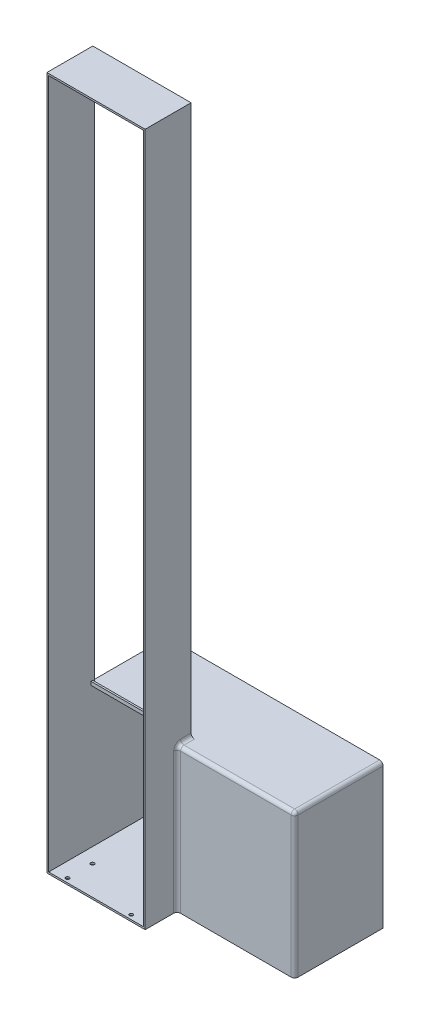
ISO-10303-21;
HEADER;
FILE_DESCRIPTION(('STEP AP214'),'2;1');
FILE_NAME('part.step','',(''),(''),'','','');
FILE_SCHEMA(('AUTOMOTIVE_DESIGN { 1 0 10303 214 1 1 1 1 }'));
ENDSEC;
DATA;
#1=APPLICATION_CONTEXT('core data for automotive mechanical design processes');
#2=APPLICATION_PROTOCOL_DEFINITION('international standard','automotive_design',2000,#1);
#3=PRODUCT_CONTEXT('',#1,'mechanical');
#4=PRODUCT('Part','Part','',(#3));
#5=PRODUCT_RELATED_PRODUCT_CATEGORY('part','',(#4));
#6=PRODUCT_DEFINITION_FORMATION('','',#4);
#7=PRODUCT_DEFINITION_CONTEXT('part definition',#1,'design');
#8=PRODUCT_DEFINITION('design','',#6,#7);
#9=PRODUCT_DEFINITION_SHAPE('','',#8);
#10=(LENGTH_UNIT() NAMED_UNIT(*) SI_UNIT(.MILLI.,.METRE.));
#11=(NAMED_UNIT(*) PLANE_ANGLE_UNIT() SI_UNIT($,.RADIAN.));
#12=(NAMED_UNIT(*) SI_UNIT($,.STERADIAN.) SOLID_ANGLE_UNIT());
#13=UNCERTAINTY_MEASURE_WITH_UNIT(LENGTH_MEASURE(1.E-05),#10,'distance_accuracy_value','');
#14=(GEOMETRIC_REPRESENTATION_CONTEXT(3) GLOBAL_UNCERTAINTY_ASSIGNED_CONTEXT((#13)) GLOBAL_UNIT_ASSIGNED_CONTEXT((#10,
#11,#12)) REPRESENTATION_CONTEXT('',''));
#15=CARTESIAN_POINT('',(0.,0.,0.));
#16=DIRECTION('',(0.,0.,1.));
#17=DIRECTION('',(1.,0.,0.));
#18=AXIS2_PLACEMENT_3D('',#15,#16,#17);
#19=CARTESIAN_POINT('',(-135.,-585.61875,-252.6145));
#20=DIRECTION('',(-1.,0.,0.));
#21=DIRECTION('',(0.,0.,1.));
#22=AXIS2_PLACEMENT_3D('',#19,#20,#21);
#23=PLANE('',#22);
#24=DIRECTION('',(0.,-1.,0.));
#25=VECTOR('',#24,1.);
#26=CARTESIAN_POINT('',(-135.,-585.61875,-35.3945000000002));
#27=LINE('',#26,#25);
#28=CARTESIAN_POINT('',(-135.,-575.61875,-35.3945000000002));
#29=VERTEX_POINT('',#28);
#30=CARTESIAN_POINT('',(-135.,-580.61875,-35.3945000000002));
#31=VERTEX_POINT('',#30);
#32=EDGE_CURVE('E469',#29,#31,#27,.T.);
#33=ORIENTED_EDGE('',*,*,#32,.T.);
#34=DIRECTION('',(0.,0.,1.));
#35=VECTOR('',#34,1.);
#36=CARTESIAN_POINT('',(-135.,-580.61875,0.));
#37=LINE('',#36,#35);
#38=CARTESIAN_POINT('',(-135.,-580.61875,-40.3945000000002));
#39=VERTEX_POINT('',#38);
#40=EDGE_CURVE('E366',#39,#31,#37,.T.);
#41=ORIENTED_EDGE('',*,*,#40,.F.);
#42=DIRECTION('',(0.,-1.,0.));
#43=VECTOR('',#42,1.);
#44=CARTESIAN_POINT('',(-135.,979.38125,-40.3945000000002));
#45=LINE('',#44,#43);
#46=CARTESIAN_POINT('',(-135.,979.38125,-40.3945000000002));
#47=VERTEX_POINT('',#46);
#48=EDGE_CURVE('E244',#47,#39,#45,.T.);
#49=ORIENTED_EDGE('',*,*,#48,.F.);
#50=DIRECTION('',(0.,0.,-1.));
#51=VECTOR('',#50,1.);
#52=CARTESIAN_POINT('',(-135.,979.38125,90.3874999999998));
#53=LINE('',#52,#51);
#54=CARTESIAN_POINT('',(-135.,979.38125,90.3874999999998));
#55=VERTEX_POINT('',#54);
#56=EDGE_CURVE('E238',#55,#47,#53,.T.);
#57=ORIENTED_EDGE('',*,*,#56,.F.);
#58=DIRECTION('',(0.,-1.,0.));
#59=VECTOR('',#58,1.);
#60=CARTESIAN_POINT('',(-135.,-585.61875,90.3874999999998));
#61=LINE('',#60,#59);
#62=CARTESIAN_POINT('',(-135.,-985.61875,90.3874999999998));
#63=VERTEX_POINT('',#62);
#64=EDGE_CURVE('E303',#55,#63,#61,.T.);
#65=ORIENTED_EDGE('',*,*,#64,.T.);
#66=DIRECTION('',(0.,0.,-1.));
#67=VECTOR('',#66,1.);
#68=CARTESIAN_POINT('',(-135.,-985.61875,-252.6145));
#69=LINE('',#68,#67);
#70=CARTESIAN_POINT('',(-135.,-985.61875,-252.6145));
#71=VERTEX_POINT('',#70);
#72=EDGE_CURVE('E297',#63,#71,#69,.T.);
#73=ORIENTED_EDGE('',*,*,#72,.T.);
#74=DIRECTION('',(0.,-1.,0.));
#75=VECTOR('',#74,1.);
#76=CARTESIAN_POINT('',(-135.,-585.61875,-252.6145));
#77=LINE('',#76,#75);
#78=CARTESIAN_POINT('',(-135.,-585.61875,-252.6145));
#79=VERTEX_POINT('',#78);
#80=EDGE_CURVE('E300',#79,#71,#77,.T.);
#81=ORIENTED_EDGE('',*,*,#80,.F.);
#82=DIRECTION('',(0.,0.,-1.));
#83=VECTOR('',#82,1.);
#84=CARTESIAN_POINT('',(-135.,-585.61875,-252.6145));
#85=LINE('',#84,#83);
#86=CARTESIAN_POINT('',(-135.,-585.61875,-30.3945000000002));
#87=VERTEX_POINT('',#86);
#88=EDGE_CURVE('E49',#87,#79,#85,.T.);
#89=ORIENTED_EDGE('',*,*,#88,.F.);
#90=DIRECTION('',(0.,1.,0.));
#91=VECTOR('',#90,1.);
#92=CARTESIAN_POINT('',(-135.,-585.61875,-30.3945000000002));
#93=LINE('',#92,#91);
#94=CARTESIAN_POINT('',(-135.,-575.61875,-30.3945000000002));
#95=VERTEX_POINT('',#94);
#96=EDGE_CURVE('E53',#87,#95,#93,.T.);
#97=ORIENTED_EDGE('',*,*,#96,.T.);
#98=DIRECTION('',(0.,0.,-1.));
#99=VECTOR('',#98,1.);
#100=CARTESIAN_POINT('',(-135.,-575.61875,-35.3945000000002));
#101=LINE('',#100,#99);
#102=EDGE_CURVE('E471',#95,#29,#101,.T.);
#103=ORIENTED_EDGE('',*,*,#102,.T.);
#104=EDGE_LOOP('',(#33,#41,#49,#57,#65,#73,#81,#89,#97,#103));
#105=FACE_BOUND('',#104,.T.);
#106=ADVANCED_FACE('F32',(#105),#23,.F.);
#107=CARTESIAN_POINT('',(135.,-585.61875,90.3874999999998));
#108=DIRECTION('',(1.,0.,0.));
#109=DIRECTION('',(0.,0.,-1.));
#110=AXIS2_PLACEMENT_3D('',#107,#108,#109);
#111=PLANE('',#110);
#112=DIRECTION('',(0.,-1.,0.));
#113=VECTOR('',#112,1.);
#114=CARTESIAN_POINT('',(135.,-585.61875,-35.3945000000002));
#115=LINE('',#114,#113);
#116=CARTESIAN_POINT('',(135.,-575.61875,-35.3945000000003));
#117=VERTEX_POINT('',#116);
#118=CARTESIAN_POINT('',(135.,-580.61875,-35.3945000000002));
#119=VERTEX_POINT('',#118);
#120=EDGE_CURVE('E484',#117,#119,#115,.T.);
#121=ORIENTED_EDGE('',*,*,#120,.F.);
#122=DIRECTION('',(0.,0.,-1.));
#123=VECTOR('',#122,1.);
#124=CARTESIAN_POINT('',(135.,-575.61875,-35.3945000000002));
#125=LINE('',#124,#123);
#126=CARTESIAN_POINT('',(135.,-575.61875,-30.3945000000002));
#127=VERTEX_POINT('',#126);
#128=EDGE_CURVE('E477',#127,#117,#125,.T.);
#129=ORIENTED_EDGE('',*,*,#128,.F.);
#130=DIRECTION('',(0.,1.,0.));
#131=VECTOR('',#130,1.);
#132=CARTESIAN_POINT('',(135.,-585.61875,-30.3945000000002));
#133=LINE('',#132,#131);
#134=CARTESIAN_POINT('',(135.,-585.61875,-30.3945000000002));
#135=VERTEX_POINT('',#134);
#136=EDGE_CURVE('E483',#135,#127,#133,.T.);
#137=ORIENTED_EDGE('',*,*,#136,.F.);
#138=DIRECTION('',(0.,0.,1.));
#139=VECTOR('',#138,1.);
#140=CARTESIAN_POINT('',(135.,-585.61875,90.3874999999998));
#141=LINE('',#140,#139);
#142=CARTESIAN_POINT('',(135.,-585.61875,-5.53750000000025));
#143=VERTEX_POINT('',#142);
#144=EDGE_CURVE('E261',#135,#143,#141,.T.);
#145=ORIENTED_EDGE('',*,*,#144,.T.);
#146=DIRECTION('',(0.,-1.,0.));
#147=VECTOR('',#146,1.);
#148=CARTESIAN_POINT('',(135.,-585.61875,-5.53750000000025));
#149=LINE('',#148,#147);
#150=CARTESIAN_POINT('',(135.,-985.61875,-5.53750000000025));
#151=VERTEX_POINT('',#150);
#152=EDGE_CURVE('E289',#143,#151,#149,.T.);
#153=ORIENTED_EDGE('',*,*,#152,.T.);
#154=DIRECTION('',(0.,0.,1.));
#155=VECTOR('',#154,1.);
#156=CARTESIAN_POINT('',(135.,-985.61875,90.3874999999998));
#157=LINE('',#156,#155);
#158=CARTESIAN_POINT('',(135.,-985.61875,90.3874999999998));
#159=VERTEX_POINT('',#158);
#160=EDGE_CURVE('E279',#151,#159,#157,.T.);
#161=ORIENTED_EDGE('',*,*,#160,.T.);
#162=DIRECTION('',(0.,-1.,0.));
#163=VECTOR('',#162,1.);
#164=CARTESIAN_POINT('',(135.,-585.61875,90.3874999999998));
#165=LINE('',#164,#163);
#166=CARTESIAN_POINT('',(135.,979.38125,90.3874999999998));
#167=VERTEX_POINT('',#166);
#168=EDGE_CURVE('E282',#167,#159,#165,.T.);
#169=ORIENTED_EDGE('',*,*,#168,.F.);
#170=DIRECTION('',(0.,0.,1.));
#171=VECTOR('',#170,1.);
#172=CARTESIAN_POINT('',(135.,979.38125,90.3874999999998));
#173=LINE('',#172,#171);
#174=CARTESIAN_POINT('',(135.,979.38125,-40.3945000000002));
#175=VERTEX_POINT('',#174);
#176=EDGE_CURVE('E247',#175,#167,#173,.T.);
#177=ORIENTED_EDGE('',*,*,#176,.F.);
#178=DIRECTION('',(0.,-1.,0.));
#179=VECTOR('',#178,1.);
#180=CARTESIAN_POINT('',(135.,979.38125,-40.3945000000002));
#181=LINE('',#180,#179);
#182=CARTESIAN_POINT('',(135.,-580.61875,-40.3945000000002));
#183=VERTEX_POINT('',#182);
#184=EDGE_CURVE('E250',#175,#183,#181,.T.);
#185=ORIENTED_EDGE('',*,*,#184,.T.);
#186=DIRECTION('',(0.,0.,1.));
#187=VECTOR('',#186,1.);
#188=CARTESIAN_POINT('',(135.,-580.61875,90.3874999999998));
#189=LINE('',#188,#187);
#190=EDGE_CURVE('E251',#183,#119,#189,.T.);
#191=ORIENTED_EDGE('',*,*,#190,.T.);
#192=EDGE_LOOP('',(#121,#129,#137,#145,#153,#161,#169,#177,#185,#191));
#193=FACE_BOUND('',#192,.T.);
#194=ADVANCED_FACE('F497',(#193),#111,.F.);
#195=CARTESIAN_POINT('',(0.,-580.61875,0.));
#196=DIRECTION('',(0.,1.,0.));
#197=DIRECTION('',(0.,0.,1.));
#198=AXIS2_PLACEMENT_3D('',#195,#196,#197);
#199=PLANE('',#198);
#200=DIRECTION('',(1.,0.,0.));
#201=VECTOR('',#200,1.);
#202=CARTESIAN_POINT('',(474.951,-580.61875,-10.5375000000003));
#203=LINE('',#202,#201);
#204=CARTESIAN_POINT('',(150.,-580.61875,-10.5375000000003));
#205=VERTEX_POINT('',#204);
#206=CARTESIAN_POINT('',(464.951,-580.61875,-10.5375000000003));
#207=VERTEX_POINT('',#206);
#208=EDGE_CURVE('E384',#205,#207,#203,.T.);
#209=ORIENTED_EDGE('',*,*,#208,.T.);
#210=DIRECTION('',(0.,0.,-1.));
#211=VECTOR('',#210,1.);
#212=CARTESIAN_POINT('',(464.951,-580.61875,-252.6145));
#213=LINE('',#212,#211);
#214=CARTESIAN_POINT('',(464.951,-580.61875,-252.6145));
#215=VERTEX_POINT('',#214);
#216=EDGE_CURVE('E386',#207,#215,#213,.T.);
#217=ORIENTED_EDGE('',*,*,#216,.T.);
#218=DIRECTION('',(-1.,0.,0.));
#219=VECTOR('',#218,1.);
#220=CARTESIAN_POINT('',(-135.,-580.61875,-252.6145));
#221=LINE('',#220,#219);
#222=CARTESIAN_POINT('',(-140.,-580.61875,-252.6145));
#223=VERTEX_POINT('',#222);
#224=EDGE_CURVE('E262',#215,#223,#221,.T.);
#225=ORIENTED_EDGE('',*,*,#224,.T.);
#226=DIRECTION('',(0.,0.,1.));
#227=VECTOR('',#226,1.);
#228=CARTESIAN_POINT('',(-140.,-580.61875,-252.6145));
#229=LINE('',#228,#227);
#230=CARTESIAN_POINT('',(-140.,-580.61875,-40.3945000000002));
#231=VERTEX_POINT('',#230);
#232=EDGE_CURVE('E264',#223,#231,#229,.T.);
#233=ORIENTED_EDGE('',*,*,#232,.T.);
#234=DIRECTION('',(-1.,0.,0.));
#235=VECTOR('',#234,1.);
#236=CARTESIAN_POINT('',(-135.,-580.61875,-40.3945000000002));
#237=LINE('',#236,#235);
#238=EDGE_CURVE('E235',#39,#231,#237,.T.);
#239=ORIENTED_EDGE('',*,*,#238,.F.);
#240=ORIENTED_EDGE('',*,*,#40,.T.);
#241=DIRECTION('',(1.,0.,0.));
#242=VECTOR('',#241,1.);
#243=CARTESIAN_POINT('',(135.,-580.61875,-35.3945000000002));
#244=LINE('',#243,#242);
#245=EDGE_CURVE('E268',#31,#119,#244,.T.);
#246=ORIENTED_EDGE('',*,*,#245,.T.);
#247=ORIENTED_EDGE('',*,*,#190,.F.);
#248=DIRECTION('',(-1.,0.,0.));
#249=VECTOR('',#248,1.);
#250=CARTESIAN_POINT('',(135.,-580.61875,-40.3945000000002));
#251=LINE('',#250,#249);
#252=CARTESIAN_POINT('',(150.,-580.61875,-40.3945000000002));
#253=VERTEX_POINT('',#252);
#254=EDGE_CURVE('E246',#253,#183,#251,.T.);
#255=ORIENTED_EDGE('',*,*,#254,.F.);
#256=DIRECTION('',(0.,0.,-1.));
#257=VECTOR('',#256,1.);
#258=CARTESIAN_POINT('',(150.,-580.61875,0.));
#259=LINE('',#258,#257);
#260=EDGE_CURVE('E382',#253,#205,#259,.F.);
#261=ORIENTED_EDGE('',*,*,#260,.T.);
#262=EDGE_LOOP('',(#209,#217,#225,#233,#239,#240,#246,#247,#255,#261));
#263=FACE_BOUND('',#262,.T.);
#264=ADVANCED_FACE('F427',(#263),#199,.T.);
#265=CARTESIAN_POINT('',(0.,-985.61875,0.));
#266=DIRECTION('',(0.,1.,0.));
#267=DIRECTION('',(0.,0.,1.));
#268=AXIS2_PLACEMENT_3D('',#265,#266,#267);
#269=PLANE('',#268);
#270=CARTESIAN_POINT('',(-92.9999999999998,-985.61875,78.3874999999998));
#271=DIRECTION('',(0.,-1.,0.));
#272=DIRECTION('',(0.,0.,-1.));
#273=AXIS2_PLACEMENT_3D('',#270,#271,#272);
#274=CIRCLE('',#273,5.00000000000001);
#275=CARTESIAN_POINT('',(-92.9999999999998,-985.61875,73.3874999999998));
#276=VERTEX_POINT('',#275);
#277=EDGE_CURVE('E310',#276,#276,#274,.T.);
#278=ORIENTED_EDGE('',*,*,#277,.T.);
#279=EDGE_LOOP('',(#278));
#280=FACE_BOUND('',#279,.T.);
#281=CARTESIAN_POINT('',(88.0000000000002,-985.61875,7.38749999999978));
#282=DIRECTION('',(0.,-1.,0.));
#283=DIRECTION('',(0.,0.,-1.));
#284=AXIS2_PLACEMENT_3D('',#281,#282,#283);
#285=CIRCLE('',#284,5.);
#286=CARTESIAN_POINT('',(88.0000000000002,-985.61875,2.38749999999978));
#287=VERTEX_POINT('',#286);
#288=EDGE_CURVE('E322',#287,#287,#285,.T.);
#289=ORIENTED_EDGE('',*,*,#288,.T.);
#290=EDGE_LOOP('',(#289));
#291=FACE_BOUND('',#290,.T.);
#292=CARTESIAN_POINT('',(88.0000000000002,-985.61875,-194.6125));
#293=DIRECTION('',(0.,-1.,0.));
#294=DIRECTION('',(0.,0.,-1.));
#295=AXIS2_PLACEMENT_3D('',#292,#293,#294);
#296=CIRCLE('',#295,5.00000000000001);
#297=CARTESIAN_POINT('',(88.0000000000002,-985.61875,-199.6125));
#298=VERTEX_POINT('',#297);
#299=EDGE_CURVE('E334',#298,#298,#296,.T.);
#300=ORIENTED_EDGE('',*,*,#299,.T.);
#301=EDGE_LOOP('',(#300));
#302=FACE_BOUND('',#301,.T.);
#303=CARTESIAN_POINT('',(-92.9999999999998,-985.61875,-194.6125));
#304=DIRECTION('',(0.,-1.,0.));
#305=DIRECTION('',(0.,0.,-1.));
#306=AXIS2_PLACEMENT_3D('',#303,#304,#305);
#307=CIRCLE('',#306,5.00000000000001);
#308=CARTESIAN_POINT('',(-92.9999999999998,-985.61875,-199.6125));
#309=VERTEX_POINT('',#308);
#310=EDGE_CURVE('E328',#309,#309,#307,.T.);
#311=ORIENTED_EDGE('',*,*,#310,.T.);
#312=EDGE_LOOP('',(#311));
#313=FACE_BOUND('',#312,.T.);
#314=CARTESIAN_POINT('',(-92.9999999999998,-985.61875,7.38749999999978));
#315=DIRECTION('',(0.,-1.,0.));
#316=DIRECTION('',(0.,0.,-1.));
#317=AXIS2_PLACEMENT_3D('',#314,#315,#316);
#318=CIRCLE('',#317,5.);
#319=CARTESIAN_POINT('',(-92.9999999999998,-985.61875,2.38749999999978));
#320=VERTEX_POINT('',#319);
#321=EDGE_CURVE('E316',#320,#320,#318,.T.);
#322=ORIENTED_EDGE('',*,*,#321,.T.);
#323=EDGE_LOOP('',(#322));
#324=FACE_BOUND('',#323,.T.);
#325=CARTESIAN_POINT('',(88.0000000000002,-985.61875,78.3874999999998));
#326=DIRECTION('',(0.,-1.,0.));
#327=DIRECTION('',(0.,0.,-1.));
#328=AXIS2_PLACEMENT_3D('',#325,#326,#327);
#329=CIRCLE('',#328,5.00000000000001);
#330=CARTESIAN_POINT('',(88.0000000000002,-985.61875,73.3874999999998));
#331=VERTEX_POINT('',#330);
#332=EDGE_CURVE('E306',#331,#331,#329,.T.);
#333=ORIENTED_EDGE('',*,*,#332,.T.);
#334=EDGE_LOOP('',(#333));
#335=FACE_BOUND('',#334,.T.);
#336=DIRECTION('',(-1.,0.,0.));
#337=VECTOR('',#336,1.);
#338=CARTESIAN_POINT('',(135.,-985.61875,-5.53750000000025));
#339=LINE('',#338,#337);
#340=CARTESIAN_POINT('',(469.951,-985.61875,-5.53750000000025));
#341=VERTEX_POINT('',#340);
#342=EDGE_CURVE('E284',#341,#151,#339,.T.);
#343=ORIENTED_EDGE('',*,*,#342,.F.);
#344=DIRECTION('',(0.,0.,1.));
#345=VECTOR('',#344,1.);
#346=CARTESIAN_POINT('',(469.951,-985.61875,-5.53750000000025));
#347=LINE('',#346,#345);
#348=CARTESIAN_POINT('',(469.951,-985.61875,-252.6145));
#349=VERTEX_POINT('',#348);
#350=EDGE_CURVE('E274',#349,#341,#347,.T.);
#351=ORIENTED_EDGE('',*,*,#350,.F.);
#352=DIRECTION('',(1.,0.,0.));
#353=VECTOR('',#352,1.);
#354=CARTESIAN_POINT('',(474.951,-985.61875,-252.6145));
#355=LINE('',#354,#353);
#356=EDGE_CURVE('E340',#71,#349,#355,.T.);
#357=ORIENTED_EDGE('',*,*,#356,.F.);
#358=ORIENTED_EDGE('',*,*,#72,.F.);
#359=DIRECTION('',(-1.,0.,0.));
#360=VECTOR('',#359,1.);
#361=CARTESIAN_POINT('',(-140.,-985.61875,90.3874999999998));
#362=LINE('',#361,#360);
#363=EDGE_CURVE('E345',#159,#63,#362,.T.);
#364=ORIENTED_EDGE('',*,*,#363,.F.);
#365=ORIENTED_EDGE('',*,*,#160,.F.);
#366=EDGE_LOOP('',(#343,#351,#357,#358,#364,#365));
#367=FACE_BOUND('',#366,.T.);
#368=ADVANCED_FACE('F544',(#280,#291,#302,#313,#324,#335,#367),#269,.T.);
#369=CARTESIAN_POINT('',(0.,-990.61875,0.));
#370=DIRECTION('',(0.,1.,0.));
#371=DIRECTION('',(0.,0.,1.));
#372=AXIS2_PLACEMENT_3D('',#369,#370,#371);
#373=PLANE('',#372);
#374=DIRECTION('',(0.,0.,1.));
#375=VECTOR('',#374,1.);
#376=CARTESIAN_POINT('',(474.951,-990.61875,-0.537500000000255));
#377=LINE('',#376,#375);
#378=CARTESIAN_POINT('',(474.951,-990.61875,-252.6145));
#379=VERTEX_POINT('',#378);
#380=CARTESIAN_POINT('',(474.951,-990.61875,-10.5375000000003));
#381=VERTEX_POINT('',#380);
#382=EDGE_CURVE('E347',#379,#381,#377,.T.);
#383=ORIENTED_EDGE('',*,*,#382,.T.);
#384=CARTESIAN_POINT('',(464.951,-990.61875,-10.5375000000003));
#385=DIRECTION('',(0.,1.,0.));
#386=DIRECTION('',(0.,0.,1.));
#387=AXIS2_PLACEMENT_3D('',#384,#385,#386);
#388=CIRCLE('',#387,10.);
#389=CARTESIAN_POINT('',(464.951,-990.61875,-0.537500000000255));
#390=VERTEX_POINT('',#389);
#391=EDGE_CURVE('E380',#381,#390,#388,.F.);
#392=ORIENTED_EDGE('',*,*,#391,.T.);
#393=DIRECTION('',(-1.,0.,0.));
#394=VECTOR('',#393,1.);
#395=CARTESIAN_POINT('',(140.,-990.61875,-0.537500000000255));
#396=LINE('',#395,#394);
#397=CARTESIAN_POINT('',(150.,-990.61875,-0.537500000000255));
#398=VERTEX_POINT('',#397);
#399=EDGE_CURVE('E350',#390,#398,#396,.T.);
#400=ORIENTED_EDGE('',*,*,#399,.T.);
#401=CARTESIAN_POINT('',(150.,-990.61875,9.46249999999975));
#402=DIRECTION('',(0.,1.,0.));
#403=DIRECTION('',(0.,0.,1.));
#404=AXIS2_PLACEMENT_3D('',#401,#402,#403);
#405=CIRCLE('',#404,10.);
#406=CARTESIAN_POINT('',(140.,-990.61875,9.46249999999975));
#407=VERTEX_POINT('',#406);
#408=EDGE_CURVE('E11',#398,#407,#405,.T.);
#409=ORIENTED_EDGE('',*,*,#408,.T.);
#410=DIRECTION('',(0.,0.,1.));
#411=VECTOR('',#410,1.);
#412=CARTESIAN_POINT('',(140.,-990.61875,90.3874999999998));
#413=LINE('',#412,#411);
#414=CARTESIAN_POINT('',(140.,-990.61875,90.3874999999998));
#415=VERTEX_POINT('',#414);
#416=EDGE_CURVE('E353',#407,#415,#413,.T.);
#417=ORIENTED_EDGE('',*,*,#416,.T.);
#418=DIRECTION('',(-1.,0.,0.));
#419=VECTOR('',#418,1.);
#420=CARTESIAN_POINT('',(-140.,-990.61875,90.3874999999998));
#421=LINE('',#420,#419);
#422=CARTESIAN_POINT('',(-140.,-990.61875,90.3874999999998));
#423=VERTEX_POINT('',#422);
#424=EDGE_CURVE('E208',#415,#423,#421,.T.);
#425=ORIENTED_EDGE('',*,*,#424,.T.);
#426=DIRECTION('',(0.,0.,-1.));
#427=VECTOR('',#426,1.);
#428=CARTESIAN_POINT('',(-140.,-990.61875,-252.6145));
#429=LINE('',#428,#427);
#430=CARTESIAN_POINT('',(-140.,-990.61875,-252.6145));
#431=VERTEX_POINT('',#430);
#432=EDGE_CURVE('E204',#423,#431,#429,.T.);
#433=ORIENTED_EDGE('',*,*,#432,.T.);
#434=DIRECTION('',(1.,0.,0.));
#435=VECTOR('',#434,1.);
#436=CARTESIAN_POINT('',(474.951,-990.61875,-252.6145));
#437=LINE('',#436,#435);
#438=EDGE_CURVE('E344',#431,#379,#437,.T.);
#439=ORIENTED_EDGE('',*,*,#438,.T.);
#440=EDGE_LOOP('',(#383,#392,#400,#409,#417,#425,#433,#439));
#441=FACE_BOUND('',#440,.T.);
#442=CARTESIAN_POINT('',(88.0000000000002,-990.61875,-194.6125));
#443=DIRECTION('',(0.,-1.,0.));
#444=DIRECTION('',(0.,0.,-1.));
#445=AXIS2_PLACEMENT_3D('',#442,#443,#444);
#446=CIRCLE('',#445,5.00000000000001);
#447=CARTESIAN_POINT('',(88.0000000000002,-990.61875,-199.6125));
#448=VERTEX_POINT('',#447);
#449=EDGE_CURVE('E337',#448,#448,#446,.T.);
#450=ORIENTED_EDGE('',*,*,#449,.F.);
#451=EDGE_LOOP('',(#450));
#452=FACE_BOUND('',#451,.T.);
#453=CARTESIAN_POINT('',(-92.9999999999998,-990.61875,-194.6125));
#454=DIRECTION('',(0.,-1.,0.));
#455=DIRECTION('',(0.,0.,-1.));
#456=AXIS2_PLACEMENT_3D('',#453,#454,#455);
#457=CIRCLE('',#456,5.00000000000001);
#458=CARTESIAN_POINT('',(-92.9999999999998,-990.61875,-199.6125));
#459=VERTEX_POINT('',#458);
#460=EDGE_CURVE('E331',#459,#459,#457,.T.);
#461=ORIENTED_EDGE('',*,*,#460,.F.);
#462=EDGE_LOOP('',(#461));
#463=FACE_BOUND('',#462,.T.);
#464=CARTESIAN_POINT('',(88.0000000000002,-990.61875,7.38749999999978));
#465=DIRECTION('',(0.,-1.,0.));
#466=DIRECTION('',(0.,0.,-1.));
#467=AXIS2_PLACEMENT_3D('',#464,#465,#466);
#468=CIRCLE('',#467,5.);
#469=CARTESIAN_POINT('',(88.0000000000002,-990.61875,2.38749999999978));
#470=VERTEX_POINT('',#469);
#471=EDGE_CURVE('E325',#470,#470,#468,.T.);
#472=ORIENTED_EDGE('',*,*,#471,.F.);
#473=EDGE_LOOP('',(#472));
#474=FACE_BOUND('',#473,.T.);
#475=CARTESIAN_POINT('',(-92.9999999999998,-990.61875,7.38749999999978));
#476=DIRECTION('',(0.,-1.,0.));
#477=DIRECTION('',(0.,0.,-1.));
#478=AXIS2_PLACEMENT_3D('',#475,#476,#477);
#479=CIRCLE('',#478,5.);
#480=CARTESIAN_POINT('',(-92.9999999999998,-990.61875,2.38749999999978));
#481=VERTEX_POINT('',#480);
#482=EDGE_CURVE('E319',#481,#481,#479,.T.);
#483=ORIENTED_EDGE('',*,*,#482,.F.);
#484=EDGE_LOOP('',(#483));
#485=FACE_BOUND('',#484,.T.);
#486=CARTESIAN_POINT('',(-92.9999999999998,-990.61875,78.3874999999998));
#487=DIRECTION('',(0.,-1.,0.));
#488=DIRECTION('',(0.,0.,-1.));
#489=AXIS2_PLACEMENT_3D('',#486,#487,#488);
#490=CIRCLE('',#489,5.00000000000001);
#491=CARTESIAN_POINT('',(-92.9999999999998,-990.61875,73.3874999999998));
#492=VERTEX_POINT('',#491);
#493=EDGE_CURVE('E313',#492,#492,#490,.T.);
#494=ORIENTED_EDGE('',*,*,#493,.F.);
#495=EDGE_LOOP('',(#494));
#496=FACE_BOUND('',#495,.T.);
#497=CARTESIAN_POINT('',(88.0000000000002,-990.61875,78.3874999999998));
#498=DIRECTION('',(0.,-1.,0.));
#499=DIRECTION('',(0.,0.,-1.));
#500=AXIS2_PLACEMENT_3D('',#497,#498,#499);
#501=CIRCLE('',#500,5.00000000000001);
#502=CARTESIAN_POINT('',(88.0000000000002,-990.61875,73.3874999999998));
#503=VERTEX_POINT('',#502);
#504=EDGE_CURVE('E307',#503,#503,#501,.T.);
#505=ORIENTED_EDGE('',*,*,#504,.F.);
#506=EDGE_LOOP('',(#505));
#507=FACE_BOUND('',#506,.T.);
#508=ADVANCED_FACE('F445',(#441,#452,#463,#474,#485,#496,#507),#373,.F.);
#509=CARTESIAN_POINT('',(-140.,-990.61875,-252.6145));
#510=DIRECTION('',(1.,0.,0.));
#511=DIRECTION('',(0.,0.,-1.));
#512=AXIS2_PLACEMENT_3D('',#509,#510,#511);
#513=PLANE('',#512);
#514=DIRECTION('',(0.,1.,0.));
#515=VECTOR('',#514,1.);
#516=CARTESIAN_POINT('',(-140.,-990.61875,90.3874999999998));
#517=LINE('',#516,#515);
#518=CARTESIAN_POINT('',(-140.,984.38125,90.3874999999998));
#519=VERTEX_POINT('',#518);
#520=EDGE_CURVE('E196',#423,#519,#517,.T.);
#521=ORIENTED_EDGE('',*,*,#520,.T.);
#522=DIRECTION('',(0.,0.,1.));
#523=VECTOR('',#522,1.);
#524=CARTESIAN_POINT('',(-140.,984.38125,90.3874999999998));
#525=LINE('',#524,#523);
#526=CARTESIAN_POINT('',(-140.,984.38125,-40.3945000000002));
#527=VERTEX_POINT('',#526);
#528=EDGE_CURVE('E201',#527,#519,#525,.T.);
#529=ORIENTED_EDGE('',*,*,#528,.F.);
#530=DIRECTION('',(0.,-1.,0.));
#531=VECTOR('',#530,1.);
#532=CARTESIAN_POINT('',(-140.,979.38125,-40.3945000000002));
#533=LINE('',#532,#531);
#534=EDGE_CURVE('E241',#527,#231,#533,.T.);
#535=ORIENTED_EDGE('',*,*,#534,.T.);
#536=ORIENTED_EDGE('',*,*,#232,.F.);
#537=DIRECTION('',(0.,1.,0.));
#538=VECTOR('',#537,1.);
#539=CARTESIAN_POINT('',(-140.,-990.61875,-252.6145));
#540=LINE('',#539,#538);
#541=EDGE_CURVE('E363',#431,#223,#540,.T.);
#542=ORIENTED_EDGE('',*,*,#541,.F.);
#543=ORIENTED_EDGE('',*,*,#432,.F.);
#544=EDGE_LOOP('',(#521,#529,#535,#536,#542,#543));
#545=FACE_BOUND('',#544,.T.);
#546=ADVANCED_FACE('F198',(#545),#513,.F.);
#547=CARTESIAN_POINT('',(474.951,-990.61875,-252.6145));
#548=DIRECTION('',(0.,0.,1.));
#549=DIRECTION('',(1.,0.,0.));
#550=AXIS2_PLACEMENT_3D('',#547,#548,#549);
#551=PLANE('',#550);
#552=ORIENTED_EDGE('',*,*,#224,.F.);
#553=CARTESIAN_POINT('',(464.951,-590.61875,-252.6145));
#554=DIRECTION('',(0.,0.,1.));
#555=DIRECTION('',(1.,0.,0.));
#556=AXIS2_PLACEMENT_3D('',#553,#554,#555);
#557=CIRCLE('',#556,10.);
#558=CARTESIAN_POINT('',(474.951,-590.61875,-252.6145));
#559=VERTEX_POINT('',#558);
#560=EDGE_CURVE('E388',#215,#559,#557,.F.);
#561=ORIENTED_EDGE('',*,*,#560,.T.);
#562=DIRECTION('',(0.,1.,0.));
#563=VECTOR('',#562,1.);
#564=CARTESIAN_POINT('',(474.951,-990.61875,-252.6145));
#565=LINE('',#564,#563);
#566=EDGE_CURVE('E360',#379,#559,#565,.T.);
#567=ORIENTED_EDGE('',*,*,#566,.F.);
#568=ORIENTED_EDGE('',*,*,#438,.F.);
#569=ORIENTED_EDGE('',*,*,#541,.T.);
#570=EDGE_LOOP('',(#552,#561,#567,#568,#569));
#571=FACE_BOUND('',#570,.T.);
#572=DIRECTION('',(-1.,0.,0.));
#573=VECTOR('',#572,1.);
#574=CARTESIAN_POINT('',(-135.,-585.61875,-252.6145));
#575=LINE('',#574,#573);
#576=CARTESIAN_POINT('',(469.951,-585.61875,-252.6145));
#577=VERTEX_POINT('',#576);
#578=EDGE_CURVE('E265',#577,#79,#575,.T.);
#579=ORIENTED_EDGE('',*,*,#578,.T.);
#580=ORIENTED_EDGE('',*,*,#80,.T.);
#581=ORIENTED_EDGE('',*,*,#356,.T.);
#582=DIRECTION('',(0.,-1.,0.));
#583=VECTOR('',#582,1.);
#584=CARTESIAN_POINT('',(469.951,-585.61875,-252.6145));
#585=LINE('',#584,#583);
#586=EDGE_CURVE('E295',#577,#349,#585,.T.);
#587=ORIENTED_EDGE('',*,*,#586,.F.);
#588=EDGE_LOOP('',(#579,#580,#581,#587));
#589=FACE_BOUND('',#588,.T.);
#590=ADVANCED_FACE('F438',(#571,#589),#551,.F.);
#591=CARTESIAN_POINT('',(474.951,-990.61875,-0.537500000000255));
#592=DIRECTION('',(-1.,0.,0.));
#593=DIRECTION('',(0.,0.,1.));
#594=AXIS2_PLACEMENT_3D('',#591,#592,#593);
#595=PLANE('',#594);
#596=DIRECTION('',(0.,0.,-1.));
#597=VECTOR('',#596,1.);
#598=CARTESIAN_POINT('',(474.951,-590.61875,-0.537500000000255));
#599=LINE('',#598,#597);
#600=CARTESIAN_POINT('',(474.951,-590.61875,-10.5375000000003));
#601=VERTEX_POINT('',#600);
#602=EDGE_CURVE('E376',#559,#601,#599,.F.);
#603=ORIENTED_EDGE('',*,*,#602,.T.);
#604=DIRECTION('',(0.,1.,0.));
#605=VECTOR('',#604,1.);
#606=CARTESIAN_POINT('',(474.951,-990.61875,-10.5375000000003));
#607=LINE('',#606,#605);
#608=EDGE_CURVE('E378',#601,#381,#607,.F.);
#609=ORIENTED_EDGE('',*,*,#608,.T.);
#610=ORIENTED_EDGE('',*,*,#382,.F.);
#611=ORIENTED_EDGE('',*,*,#566,.T.);
#612=EDGE_LOOP('',(#603,#609,#610,#611));
#613=FACE_BOUND('',#612,.T.);
#614=ADVANCED_FACE('F442',(#613),#595,.F.);
#615=CARTESIAN_POINT('',(140.,-990.61875,-0.537500000000255));
#616=DIRECTION('',(0.,0.,-1.));
#617=DIRECTION('',(-1.,0.,0.));
#618=AXIS2_PLACEMENT_3D('',#615,#616,#617);
#619=PLANE('',#618);
#620=ORIENTED_EDGE('',*,*,#399,.F.);
#621=DIRECTION('',(0.,1.,0.));
#622=VECTOR('',#621,1.);
#623=CARTESIAN_POINT('',(464.951,-990.61875,-0.537500000000255));
#624=LINE('',#623,#622);
#625=CARTESIAN_POINT('',(464.951,-590.61875,-0.537500000000255));
#626=VERTEX_POINT('',#625);
#627=EDGE_CURVE('E373',#390,#626,#624,.T.);
#628=ORIENTED_EDGE('',*,*,#627,.T.);
#629=DIRECTION('',(1.,0.,0.));
#630=VECTOR('',#629,1.);
#631=CARTESIAN_POINT('',(140.,-590.61875,-0.537500000000255));
#632=LINE('',#631,#630);
#633=CARTESIAN_POINT('',(150.,-590.61875,-0.537500000000255));
#634=VERTEX_POINT('',#633);
#635=EDGE_CURVE('E371',#626,#634,#632,.F.);
#636=ORIENTED_EDGE('',*,*,#635,.T.);
#637=DIRECTION('',(0.,1.,0.));
#638=VECTOR('',#637,1.);
#639=CARTESIAN_POINT('',(150.,-990.61875,-0.537500000000255));
#640=LINE('',#639,#638);
#641=EDGE_CURVE('E369',#634,#398,#640,.F.);
#642=ORIENTED_EDGE('',*,*,#641,.T.);
#643=EDGE_LOOP('',(#620,#628,#636,#642));
#644=FACE_BOUND('',#643,.T.);
#645=ADVANCED_FACE('F453',(#644),#619,.F.);
#646=CARTESIAN_POINT('',(140.,-990.61875,90.3874999999998));
#647=DIRECTION('',(-1.,0.,0.));
#648=DIRECTION('',(0.,0.,1.));
#649=AXIS2_PLACEMENT_3D('',#646,#647,#648);
#650=PLANE('',#649);
#651=CARTESIAN_POINT('',(140.,-590.61875,-10.5375000000003));
#652=DIRECTION('',(-1.,0.,0.));
#653=DIRECTION('',(0.,0.,1.));
#654=AXIS2_PLACEMENT_3D('',#651,#652,#653);
#655=CIRCLE('',#654,20.);
#656=CARTESIAN_POINT('',(140.,-570.61875,-10.5375000000003));
#657=VERTEX_POINT('',#656);
#658=CARTESIAN_POINT('',(140.,-590.61875,9.46249999999975));
#659=VERTEX_POINT('',#658);
#660=EDGE_CURVE('E390',#657,#659,#655,.F.);
#661=ORIENTED_EDGE('',*,*,#660,.F.);
#662=DIRECTION('',(0.,0.,-1.));
#663=VECTOR('',#662,1.);
#664=CARTESIAN_POINT('',(140.,-570.61875,90.3874999999998));
#665=LINE('',#664,#663);
#666=CARTESIAN_POINT('',(140.,-570.61875,-40.3945000000002));
#667=VERTEX_POINT('',#666);
#668=EDGE_CURVE('E395',#657,#667,#665,.T.);
#669=ORIENTED_EDGE('',*,*,#668,.T.);
#670=DIRECTION('',(0.,-1.,0.));
#671=VECTOR('',#670,1.);
#672=CARTESIAN_POINT('',(140.,979.38125,-40.3945000000002));
#673=LINE('',#672,#671);
#674=CARTESIAN_POINT('',(140.,984.38125,-40.3945000000002));
#675=VERTEX_POINT('',#674);
#676=EDGE_CURVE('E258',#675,#667,#673,.T.);
#677=ORIENTED_EDGE('',*,*,#676,.F.);
#678=DIRECTION('',(0.,0.,-1.));
#679=VECTOR('',#678,1.);
#680=CARTESIAN_POINT('',(140.,984.38125,90.3874999999998));
#681=LINE('',#680,#679);
#682=CARTESIAN_POINT('',(140.,984.38125,90.3874999999998));
#683=VERTEX_POINT('',#682);
#684=EDGE_CURVE('E218',#683,#675,#681,.T.);
#685=ORIENTED_EDGE('',*,*,#684,.F.);
#686=DIRECTION('',(0.,1.,0.));
#687=VECTOR('',#686,1.);
#688=CARTESIAN_POINT('',(140.,-990.61875,90.3874999999998));
#689=LINE('',#688,#687);
#690=EDGE_CURVE('E207',#415,#683,#689,.T.);
#691=ORIENTED_EDGE('',*,*,#690,.F.);
#692=ORIENTED_EDGE('',*,*,#416,.F.);
#693=DIRECTION('',(0.,1.,0.));
#694=VECTOR('',#693,1.);
#695=CARTESIAN_POINT('',(140.,-580.61875,9.46249999999975));
#696=LINE('',#695,#694);
#697=EDGE_CURVE('E393',#407,#659,#696,.T.);
#698=ORIENTED_EDGE('',*,*,#697,.T.);
#699=EDGE_LOOP('',(#661,#669,#677,#685,#691,#692,#698));
#700=FACE_BOUND('',#699,.T.);
#701=ADVANCED_FACE('F457',(#700),#650,.F.);
#702=CARTESIAN_POINT('',(-140.,-990.61875,90.3874999999998));
#703=DIRECTION('',(0.,0.,-1.));
#704=DIRECTION('',(-1.,0.,0.));
#705=AXIS2_PLACEMENT_3D('',#702,#703,#704);
#706=PLANE('',#705);
#707=ORIENTED_EDGE('',*,*,#690,.T.);
#708=DIRECTION('',(1.,0.,0.));
#709=VECTOR('',#708,1.);
#710=CARTESIAN_POINT('',(-140.,984.38125,90.3874999999998));
#711=LINE('',#710,#709);
#712=EDGE_CURVE('E211',#519,#683,#711,.T.);
#713=ORIENTED_EDGE('',*,*,#712,.F.);
#714=ORIENTED_EDGE('',*,*,#520,.F.);
#715=ORIENTED_EDGE('',*,*,#424,.F.);
#716=EDGE_LOOP('',(#707,#713,#714,#715));
#717=FACE_BOUND('',#716,.T.);
#718=DIRECTION('',(1.,0.,0.));
#719=VECTOR('',#718,1.);
#720=CARTESIAN_POINT('',(-140.,979.38125,90.3874999999998));
#721=LINE('',#720,#719);
#722=EDGE_CURVE('E227',#55,#167,#721,.T.);
#723=ORIENTED_EDGE('',*,*,#722,.T.);
#724=ORIENTED_EDGE('',*,*,#168,.T.);
#725=ORIENTED_EDGE('',*,*,#363,.T.);
#726=ORIENTED_EDGE('',*,*,#64,.F.);
#727=EDGE_LOOP('',(#723,#724,#725,#726));
#728=FACE_BOUND('',#727,.T.);
#729=ADVANCED_FACE('F212',(#717,#728),#706,.F.);
#730=CARTESIAN_POINT('',(88.0000000000002,-990.61875,-194.6125));
#731=DIRECTION('',(0.,1.,0.));
#732=DIRECTION('',(0.,0.,1.));
#733=AXIS2_PLACEMENT_3D('',#730,#731,#732);
#734=CYLINDRICAL_SURFACE('',#733,5.00000000000001);
#735=ORIENTED_EDGE('',*,*,#449,.T.);
#736=EDGE_LOOP('',(#735));
#737=FACE_BOUND('',#736,.T.);
#738=ORIENTED_EDGE('',*,*,#299,.F.);
#739=EDGE_LOOP('',(#738));
#740=FACE_BOUND('',#739,.T.);
#741=ADVANCED_FACE('F537',(#737,#740),#734,.F.);
#742=CARTESIAN_POINT('',(-92.9999999999998,-990.61875,-194.6125));
#743=DIRECTION('',(0.,1.,0.));
#744=DIRECTION('',(0.,0.,1.));
#745=AXIS2_PLACEMENT_3D('',#742,#743,#744);
#746=CYLINDRICAL_SURFACE('',#745,5.00000000000001);
#747=ORIENTED_EDGE('',*,*,#460,.T.);
#748=EDGE_LOOP('',(#747));
#749=FACE_BOUND('',#748,.T.);
#750=ORIENTED_EDGE('',*,*,#310,.F.);
#751=EDGE_LOOP('',(#750));
#752=FACE_BOUND('',#751,.T.);
#753=ADVANCED_FACE('F533',(#749,#752),#746,.F.);
#754=CARTESIAN_POINT('',(88.0000000000002,-990.61875,7.38749999999978));
#755=DIRECTION('',(0.,1.,0.));
#756=DIRECTION('',(0.,0.,1.));
#757=AXIS2_PLACEMENT_3D('',#754,#755,#756);
#758=CYLINDRICAL_SURFACE('',#757,5.);
#759=ORIENTED_EDGE('',*,*,#471,.T.);
#760=EDGE_LOOP('',(#759));
#761=FACE_BOUND('',#760,.T.);
#762=ORIENTED_EDGE('',*,*,#288,.F.);
#763=EDGE_LOOP('',(#762));
#764=FACE_BOUND('',#763,.T.);
#765=ADVANCED_FACE('F529',(#761,#764),#758,.F.);
#766=CARTESIAN_POINT('',(-92.9999999999998,-990.61875,7.38749999999978));
#767=DIRECTION('',(0.,1.,0.));
#768=DIRECTION('',(0.,0.,1.));
#769=AXIS2_PLACEMENT_3D('',#766,#767,#768);
#770=CYLINDRICAL_SURFACE('',#769,5.);
#771=ORIENTED_EDGE('',*,*,#482,.T.);
#772=EDGE_LOOP('',(#771));
#773=FACE_BOUND('',#772,.T.);
#774=ORIENTED_EDGE('',*,*,#321,.F.);
#775=EDGE_LOOP('',(#774));
#776=FACE_BOUND('',#775,.T.);
#777=ADVANCED_FACE('F525',(#773,#776),#770,.F.);
#778=CARTESIAN_POINT('',(-92.9999999999998,-990.61875,78.3874999999998));
#779=DIRECTION('',(0.,1.,0.));
#780=DIRECTION('',(0.,0.,1.));
#781=AXIS2_PLACEMENT_3D('',#778,#779,#780);
#782=CYLINDRICAL_SURFACE('',#781,5.00000000000001);
#783=ORIENTED_EDGE('',*,*,#493,.T.);
#784=EDGE_LOOP('',(#783));
#785=FACE_BOUND('',#784,.T.);
#786=ORIENTED_EDGE('',*,*,#277,.F.);
#787=EDGE_LOOP('',(#786));
#788=FACE_BOUND('',#787,.T.);
#789=ADVANCED_FACE('F521',(#785,#788),#782,.F.);
#790=CARTESIAN_POINT('',(88.0000000000002,-990.61875,78.3874999999998));
#791=DIRECTION('',(0.,1.,0.));
#792=DIRECTION('',(0.,0.,1.));
#793=AXIS2_PLACEMENT_3D('',#790,#791,#792);
#794=CYLINDRICAL_SURFACE('',#793,5.00000000000001);
#795=ORIENTED_EDGE('',*,*,#504,.T.);
#796=EDGE_LOOP('',(#795));
#797=FACE_BOUND('',#796,.T.);
#798=ORIENTED_EDGE('',*,*,#332,.F.);
#799=EDGE_LOOP('',(#798));
#800=FACE_BOUND('',#799,.T.);
#801=ADVANCED_FACE('F518',(#797,#800),#794,.F.);
#802=CARTESIAN_POINT('',(469.951,-585.61875,-5.53750000000025));
#803=DIRECTION('',(1.,0.,0.));
#804=DIRECTION('',(0.,0.,-1.));
#805=AXIS2_PLACEMENT_3D('',#802,#803,#804);
#806=PLANE('',#805);
#807=ORIENTED_EDGE('',*,*,#350,.T.);
#808=DIRECTION('',(0.,-1.,0.));
#809=VECTOR('',#808,1.);
#810=CARTESIAN_POINT('',(469.951,-585.61875,-5.53750000000025));
#811=LINE('',#810,#809);
#812=CARTESIAN_POINT('',(469.951,-585.61875,-5.53750000000025));
#813=VERTEX_POINT('',#812);
#814=EDGE_CURVE('E292',#813,#341,#811,.T.);
#815=ORIENTED_EDGE('',*,*,#814,.F.);
#816=DIRECTION('',(0.,0.,1.));
#817=VECTOR('',#816,1.);
#818=CARTESIAN_POINT('',(469.951,-585.61875,-5.53750000000025));
#819=LINE('',#818,#817);
#820=EDGE_CURVE('E275',#577,#813,#819,.T.);
#821=ORIENTED_EDGE('',*,*,#820,.F.);
#822=ORIENTED_EDGE('',*,*,#586,.T.);
#823=EDGE_LOOP('',(#807,#815,#821,#822));
#824=FACE_BOUND('',#823,.T.);
#825=ADVANCED_FACE('F516',(#824),#806,.F.);
#826=CARTESIAN_POINT('',(135.,-585.61875,-5.53750000000025));
#827=DIRECTION('',(0.,0.,1.));
#828=DIRECTION('',(1.,0.,0.));
#829=AXIS2_PLACEMENT_3D('',#826,#827,#828);
#830=PLANE('',#829);
#831=ORIENTED_EDGE('',*,*,#342,.T.);
#832=ORIENTED_EDGE('',*,*,#152,.F.);
#833=DIRECTION('',(-1.,0.,0.));
#834=VECTOR('',#833,1.);
#835=CARTESIAN_POINT('',(135.,-585.61875,-5.53750000000025));
#836=LINE('',#835,#834);
#837=EDGE_CURVE('E278',#813,#143,#836,.T.);
#838=ORIENTED_EDGE('',*,*,#837,.F.);
#839=ORIENTED_EDGE('',*,*,#814,.T.);
#840=EDGE_LOOP('',(#831,#832,#838,#839));
#841=FACE_BOUND('',#840,.T.);
#842=ADVANCED_FACE('F620',(#841),#830,.F.);
#843=CARTESIAN_POINT('',(0.,-585.61875,0.));
#844=DIRECTION('',(0.,1.,0.));
#845=DIRECTION('',(0.,0.,1.));
#846=AXIS2_PLACEMENT_3D('',#843,#844,#845);
#847=PLANE('',#846);
#848=ORIENTED_EDGE('',*,*,#144,.F.);
#849=DIRECTION('',(1.,0.,0.));
#850=VECTOR('',#849,1.);
#851=CARTESIAN_POINT('',(-146.180339887499,-585.61875,-30.3945000000002));
#852=LINE('',#851,#850);
#853=EDGE_CURVE('E481',#87,#135,#852,.T.);
#854=ORIENTED_EDGE('',*,*,#853,.F.);
#855=ORIENTED_EDGE('',*,*,#88,.T.);
#856=ORIENTED_EDGE('',*,*,#578,.F.);
#857=ORIENTED_EDGE('',*,*,#820,.T.);
#858=ORIENTED_EDGE('',*,*,#837,.T.);
#859=EDGE_LOOP('',(#848,#854,#855,#856,#857,#858));
#860=FACE_BOUND('',#859,.T.);
#861=ADVANCED_FACE('F614',(#860),#847,.F.);
#862=CARTESIAN_POINT('',(135.,979.38125,-40.3945000000002));
#863=DIRECTION('',(0.,0.,1.));
#864=DIRECTION('',(1.,0.,0.));
#865=AXIS2_PLACEMENT_3D('',#862,#863,#864);
#866=PLANE('',#865);
#867=ORIENTED_EDGE('',*,*,#254,.T.);
#868=ORIENTED_EDGE('',*,*,#184,.F.);
#869=DIRECTION('',(-1.,0.,0.));
#870=VECTOR('',#869,1.);
#871=CARTESIAN_POINT('',(-140.,979.38125,-40.3945000000002));
#872=LINE('',#871,#870);
#873=EDGE_CURVE('E224',#175,#47,#872,.T.);
#874=ORIENTED_EDGE('',*,*,#873,.T.);
#875=ORIENTED_EDGE('',*,*,#48,.T.);
#876=ORIENTED_EDGE('',*,*,#238,.T.);
#877=ORIENTED_EDGE('',*,*,#534,.F.);
#878=DIRECTION('',(-1.,0.,0.));
#879=VECTOR('',#878,1.);
#880=CARTESIAN_POINT('',(-140.,984.38125,-40.3945000000002));
#881=LINE('',#880,#879);
#882=EDGE_CURVE('E223',#675,#527,#881,.T.);
#883=ORIENTED_EDGE('',*,*,#882,.F.);
#884=ORIENTED_EDGE('',*,*,#676,.T.);
#885=CARTESIAN_POINT('',(150.,-570.61875,-40.3945000000002));
#886=DIRECTION('',(0.,0.,1.));
#887=DIRECTION('',(1.,0.,0.));
#888=AXIS2_PLACEMENT_3D('',#885,#886,#887);
#889=CIRCLE('',#888,10.);
#890=EDGE_CURVE('E41',#667,#253,#889,.T.);
#891=ORIENTED_EDGE('',*,*,#890,.T.);
#892=EDGE_LOOP('',(#867,#868,#874,#875,#876,#877,#883,#884,#891));
#893=FACE_BOUND('',#892,.T.);
#894=ADVANCED_FACE('F464',(#893),#866,.F.);
#895=CARTESIAN_POINT('',(0.,979.38125,0.));
#896=DIRECTION('',(0.,-1.,0.));
#897=DIRECTION('',(0.,0.,-1.));
#898=AXIS2_PLACEMENT_3D('',#895,#896,#897);
#899=PLANE('',#898);
#900=ORIENTED_EDGE('',*,*,#56,.T.);
#901=ORIENTED_EDGE('',*,*,#873,.F.);
#902=ORIENTED_EDGE('',*,*,#176,.T.);
#903=ORIENTED_EDGE('',*,*,#722,.F.);
#904=EDGE_LOOP('',(#900,#901,#902,#903));
#905=FACE_BOUND('',#904,.T.);
#906=ADVANCED_FACE('F726',(#905),#899,.T.);
#907=CARTESIAN_POINT('',(0.,984.38125,0.));
#908=DIRECTION('',(0.,-1.,0.));
#909=DIRECTION('',(0.,0.,-1.));
#910=AXIS2_PLACEMENT_3D('',#907,#908,#909);
#911=PLANE('',#910);
#912=ORIENTED_EDGE('',*,*,#528,.T.);
#913=ORIENTED_EDGE('',*,*,#712,.T.);
#914=ORIENTED_EDGE('',*,*,#684,.T.);
#915=ORIENTED_EDGE('',*,*,#882,.T.);
#916=EDGE_LOOP('',(#912,#913,#914,#915));
#917=FACE_BOUND('',#916,.T.);
#918=ADVANCED_FACE('F221',(#917),#911,.F.);
#919=CARTESIAN_POINT('',(150.,-990.61875,9.46249999999975));
#920=DIRECTION('',(0.,-1.,0.));
#921=DIRECTION('',(0.,0.,-1.));
#922=AXIS2_PLACEMENT_3D('',#919,#920,#921);
#923=CYLINDRICAL_SURFACE('',#922,10.);
#924=ORIENTED_EDGE('',*,*,#408,.F.);
#925=ORIENTED_EDGE('',*,*,#641,.F.);
#926=CARTESIAN_POINT('',(150.,-590.61875,9.46249999999975));
#927=DIRECTION('',(0.,-1.,0.));
#928=DIRECTION('',(0.,0.,-1.));
#929=AXIS2_PLACEMENT_3D('',#926,#927,#928);
#930=CIRCLE('',#929,10.);
#931=EDGE_CURVE('E36',#659,#634,#930,.T.);
#932=ORIENTED_EDGE('',*,*,#931,.F.);
#933=ORIENTED_EDGE('',*,*,#697,.F.);
#934=EDGE_LOOP('',(#924,#925,#932,#933));
#935=FACE_BOUND('',#934,.T.);
#936=ADVANCED_FACE('F34',(#935),#923,.F.);
#937=CARTESIAN_POINT('',(150.,-570.61875,90.3874999999998));
#938=DIRECTION('',(0.,0.,-1.));
#939=DIRECTION('',(-1.,0.,0.));
#940=AXIS2_PLACEMENT_3D('',#937,#938,#939);
#941=CYLINDRICAL_SURFACE('',#940,10.);
#942=ORIENTED_EDGE('',*,*,#890,.F.);
#943=ORIENTED_EDGE('',*,*,#668,.F.);
#944=CARTESIAN_POINT('',(150.,-570.61875,-10.5375000000003));
#945=DIRECTION('',(0.,0.,-1.));
#946=DIRECTION('',(-1.,0.,0.));
#947=AXIS2_PLACEMENT_3D('',#944,#945,#946);
#948=CIRCLE('',#947,10.);
#949=EDGE_CURVE('E409',#205,#657,#948,.T.);
#950=ORIENTED_EDGE('',*,*,#949,.F.);
#951=ORIENTED_EDGE('',*,*,#260,.F.);
#952=EDGE_LOOP('',(#942,#943,#950,#951));
#953=FACE_BOUND('',#952,.T.);
#954=ADVANCED_FACE('F501',(#953),#941,.F.);
#955=CARTESIAN_POINT('',(150.,-590.61875,-10.5375000000003));
#956=DIRECTION('',(-1.,0.,0.));
#957=DIRECTION('',(0.,0.,1.));
#958=AXIS2_PLACEMENT_3D('',#955,#956,#957);
#959=TOROIDAL_SURFACE('',#958,20.,10.);
#960=ORIENTED_EDGE('',*,*,#660,.T.);
#961=ORIENTED_EDGE('',*,*,#931,.T.);
#962=CARTESIAN_POINT('',(150.,-590.61875,-10.5375000000003));
#963=DIRECTION('',(-1.,0.,0.));
#964=DIRECTION('',(0.,0.,1.));
#965=AXIS2_PLACEMENT_3D('',#962,#963,#964);
#966=CIRCLE('',#965,10.);
#967=EDGE_CURVE('E407',#205,#634,#966,.F.);
#968=ORIENTED_EDGE('',*,*,#967,.F.);
#969=ORIENTED_EDGE('',*,*,#949,.T.);
#970=EDGE_LOOP('',(#960,#961,#968,#969));
#971=FACE_BOUND('',#970,.T.);
#972=ADVANCED_FACE('F416',(#971),#959,.F.);
#973=CARTESIAN_POINT('',(0.,-590.61875,-10.5375000000003));
#974=DIRECTION('',(-1.,0.,0.));
#975=DIRECTION('',(0.,0.,1.));
#976=AXIS2_PLACEMENT_3D('',#973,#974,#975);
#977=CYLINDRICAL_SURFACE('',#976,10.);
#978=ORIENTED_EDGE('',*,*,#967,.T.);
#979=ORIENTED_EDGE('',*,*,#635,.F.);
#980=CARTESIAN_POINT('',(464.951,-590.61875,-10.5375000000003));
#981=DIRECTION('',(1.,0.,0.));
#982=DIRECTION('',(0.,0.,-1.));
#983=AXIS2_PLACEMENT_3D('',#980,#981,#982);
#984=CIRCLE('',#983,10.);
#985=EDGE_CURVE('E404',#207,#626,#984,.T.);
#986=ORIENTED_EDGE('',*,*,#985,.F.);
#987=ORIENTED_EDGE('',*,*,#208,.F.);
#988=EDGE_LOOP('',(#978,#979,#986,#987));
#989=FACE_BOUND('',#988,.T.);
#990=ADVANCED_FACE('F423',(#989),#977,.T.);
#991=CARTESIAN_POINT('',(464.951,-590.61875,2.0477842307013E-13));
#992=DIRECTION('',(0.,0.,1.));
#993=DIRECTION('',(1.,0.,0.));
#994=AXIS2_PLACEMENT_3D('',#991,#992,#993);
#995=CYLINDRICAL_SURFACE('',#994,10.);
#996=ORIENTED_EDGE('',*,*,#560,.F.);
#997=ORIENTED_EDGE('',*,*,#216,.F.);
#998=CARTESIAN_POINT('',(464.951,-590.61875,-10.5375000000003));
#999=DIRECTION('',(0.,0.,1.));
#1000=DIRECTION('',(1.,0.,0.));
#1001=AXIS2_PLACEMENT_3D('',#998,#999,#1000);
#1002=CIRCLE('',#1001,10.);
#1003=EDGE_CURVE('E401',#601,#207,#1002,.T.);
#1004=ORIENTED_EDGE('',*,*,#1003,.F.);
#1005=ORIENTED_EDGE('',*,*,#602,.F.);
#1006=EDGE_LOOP('',(#996,#997,#1004,#1005));
#1007=FACE_BOUND('',#1006,.T.);
#1008=ADVANCED_FACE('F433',(#1007),#995,.T.);
#1009=CARTESIAN_POINT('',(464.951,-590.61875,-10.5375000000003));
#1010=DIRECTION('',(0.,0.,1.));
#1011=DIRECTION('',(1.,0.,0.));
#1012=AXIS2_PLACEMENT_3D('',#1009,#1010,#1011);
#1013=SPHERICAL_SURFACE('',#1012,10.);
#1014=ORIENTED_EDGE('',*,*,#1003,.T.);
#1015=ORIENTED_EDGE('',*,*,#985,.T.);
#1016=CARTESIAN_POINT('',(464.951,-590.61875,-10.5375000000003));
#1017=DIRECTION('',(0.,1.,0.));
#1018=DIRECTION('',(0.,0.,1.));
#1019=AXIS2_PLACEMENT_3D('',#1016,#1017,#1018);
#1020=CIRCLE('',#1019,10.);
#1021=EDGE_CURVE('E399',#601,#626,#1020,.F.);
#1022=ORIENTED_EDGE('',*,*,#1021,.F.);
#1023=EDGE_LOOP('',(#1014,#1015,#1022));
#1024=FACE_BOUND('',#1023,.T.);
#1025=ADVANCED_FACE('F562',(#1024),#1013,.T.);
#1026=CARTESIAN_POINT('',(464.951,-990.61875,-10.5375000000003));
#1027=DIRECTION('',(0.,1.,0.));
#1028=DIRECTION('',(0.,0.,1.));
#1029=AXIS2_PLACEMENT_3D('',#1026,#1027,#1028);
#1030=CYLINDRICAL_SURFACE('',#1029,10.);
#1031=ORIENTED_EDGE('',*,*,#391,.F.);
#1032=ORIENTED_EDGE('',*,*,#608,.F.);
#1033=ORIENTED_EDGE('',*,*,#1021,.T.);
#1034=ORIENTED_EDGE('',*,*,#627,.F.);
#1035=EDGE_LOOP('',(#1031,#1032,#1033,#1034));
#1036=FACE_BOUND('',#1035,.T.);
#1037=ADVANCED_FACE('F450',(#1036),#1030,.T.);
#1038=CARTESIAN_POINT('',(-146.180339887499,-585.61875,-35.3945000000002));
#1039=DIRECTION('',(0.,0.,1.));
#1040=DIRECTION('',(1.,0.,0.));
#1041=AXIS2_PLACEMENT_3D('',#1038,#1039,#1040);
#1042=PLANE('',#1041);
#1043=ORIENTED_EDGE('',*,*,#245,.F.);
#1044=ORIENTED_EDGE('',*,*,#32,.F.);
#1045=DIRECTION('',(1.,0.,0.));
#1046=VECTOR('',#1045,1.);
#1047=CARTESIAN_POINT('',(-146.180339887499,-575.61875,-35.3945000000002));
#1048=LINE('',#1047,#1046);
#1049=EDGE_CURVE('E230',#29,#117,#1048,.T.);
#1050=ORIENTED_EDGE('',*,*,#1049,.T.);
#1051=ORIENTED_EDGE('',*,*,#120,.T.);
#1052=EDGE_LOOP('',(#1043,#1044,#1050,#1051));
#1053=FACE_BOUND('',#1052,.T.);
#1054=ADVANCED_FACE('F494',(#1053),#1042,.F.);
#1055=CARTESIAN_POINT('',(-146.180339887499,-585.61875,-30.3945000000002));
#1056=DIRECTION('',(0.,0.,-1.));
#1057=DIRECTION('',(-1.,0.,0.));
#1058=AXIS2_PLACEMENT_3D('',#1055,#1056,#1057);
#1059=PLANE('',#1058);
#1060=ORIENTED_EDGE('',*,*,#96,.F.);
#1061=ORIENTED_EDGE('',*,*,#853,.T.);
#1062=ORIENTED_EDGE('',*,*,#136,.T.);
#1063=DIRECTION('',(1.,0.,0.));
#1064=VECTOR('',#1063,1.);
#1065=CARTESIAN_POINT('',(-146.180339887499,-575.61875,-30.3945000000002));
#1066=LINE('',#1065,#1064);
#1067=EDGE_CURVE('E485',#95,#127,#1066,.T.);
#1068=ORIENTED_EDGE('',*,*,#1067,.F.);
#1069=EDGE_LOOP('',(#1060,#1061,#1062,#1068));
#1070=FACE_BOUND('',#1069,.T.);
#1071=ADVANCED_FACE('F591',(#1070),#1059,.F.);
#1072=CARTESIAN_POINT('',(-146.180339887499,-575.61875,-35.3945000000002));
#1073=DIRECTION('',(0.,-1.,0.));
#1074=DIRECTION('',(0.,0.,-1.));
#1075=AXIS2_PLACEMENT_3D('',#1072,#1073,#1074);
#1076=PLANE('',#1075);
#1077=ORIENTED_EDGE('',*,*,#102,.F.);
#1078=ORIENTED_EDGE('',*,*,#1067,.T.);
#1079=ORIENTED_EDGE('',*,*,#128,.T.);
#1080=ORIENTED_EDGE('',*,*,#1049,.F.);
#1081=EDGE_LOOP('',(#1077,#1078,#1079,#1080));
#1082=FACE_BOUND('',#1081,.T.);
#1083=ADVANCED_FACE('F495',(#1082),#1076,.F.);
#1084=CLOSED_SHELL('',(#106,#194,#264,#368,#508,#546,#590,#614,#645,#701,#729,#741,#753,#765,
#777,#789,#801,#825,#842,#861,#894,#906,#918,#936,#954,#972,#990,#1008,#1025,#1037,#1054,#1071,#1083));
#1085=MANIFOLD_SOLID_BREP('B2',#1084);
#1086=ADVANCED_BREP_SHAPE_REPRESENTATION('',(#18,#1085),#14);
#1087=SHAPE_DEFINITION_REPRESENTATION(#9,#1086);
ENDSEC;
END-ISO-10303-21;
